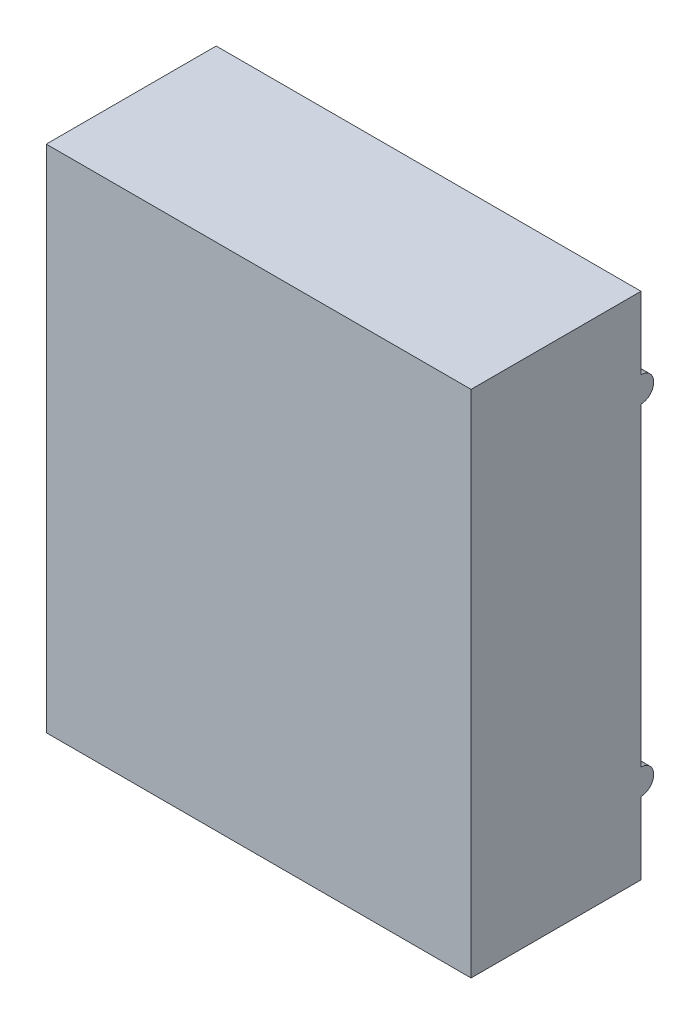
ISO-10303-21;
HEADER;
FILE_DESCRIPTION(('STEP AP214'),'2;1');
FILE_NAME('part.step','',(''),(''),'','','');
FILE_SCHEMA(('AUTOMOTIVE_DESIGN { 1 0 10303 214 1 1 1 1 }'));
ENDSEC;
DATA;
#1=APPLICATION_CONTEXT('core data for automotive mechanical design processes');
#2=APPLICATION_PROTOCOL_DEFINITION('international standard','automotive_design',2000,#1);
#3=PRODUCT_CONTEXT('',#1,'mechanical');
#4=PRODUCT('Part','Part','',(#3));
#5=PRODUCT_RELATED_PRODUCT_CATEGORY('part','',(#4));
#6=PRODUCT_DEFINITION_FORMATION('','',#4);
#7=PRODUCT_DEFINITION_CONTEXT('part definition',#1,'design');
#8=PRODUCT_DEFINITION('design','',#6,#7);
#9=PRODUCT_DEFINITION_SHAPE('','',#8);
#10=(LENGTH_UNIT() NAMED_UNIT(*) SI_UNIT(.MILLI.,.METRE.));
#11=(NAMED_UNIT(*) PLANE_ANGLE_UNIT() SI_UNIT($,.RADIAN.));
#12=(NAMED_UNIT(*) SI_UNIT($,.STERADIAN.) SOLID_ANGLE_UNIT());
#13=UNCERTAINTY_MEASURE_WITH_UNIT(LENGTH_MEASURE(1.E-05),#10,'distance_accuracy_value','');
#14=(GEOMETRIC_REPRESENTATION_CONTEXT(3) GLOBAL_UNCERTAINTY_ASSIGNED_CONTEXT((#13)) GLOBAL_UNIT_ASSIGNED_CONTEXT((#10,
#11,#12)) REPRESENTATION_CONTEXT('',''));
#15=CARTESIAN_POINT('',(0.,0.,0.));
#16=DIRECTION('',(0.,0.,1.));
#17=DIRECTION('',(1.,0.,0.));
#18=AXIS2_PLACEMENT_3D('',#15,#16,#17);
#19=CARTESIAN_POINT('',(0.,0.,0.));
#20=DIRECTION('',(0.,0.,-1.));
#21=DIRECTION('',(-1.,0.,0.));
#22=AXIS2_PLACEMENT_3D('',#19,#20,#21);
#23=PLANE('',#22);
#24=DIRECTION('',(1.,0.,0.));
#25=VECTOR('',#24,1.);
#26=CARTESIAN_POINT('',(115.,-92.5,0.));
#27=LINE('',#26,#25);
#28=CARTESIAN_POINT('',(115.,-92.5,0.));
#29=VERTEX_POINT('',#28);
#30=CARTESIAN_POINT('',(125.,-92.5,0.));
#31=VERTEX_POINT('',#30);
#32=EDGE_CURVE('E173',#29,#31,#27,.T.);
#33=ORIENTED_EDGE('',*,*,#32,.F.);
#34=DIRECTION('',(0.,-1.,0.));
#35=VECTOR('',#34,1.);
#36=CARTESIAN_POINT('',(115.,0.,0.));
#37=LINE('',#36,#35);
#38=CARTESIAN_POINT('',(115.,-107.5,0.));
#39=VERTEX_POINT('',#38);
#40=EDGE_CURVE('E11',#29,#39,#37,.T.);
#41=ORIENTED_EDGE('',*,*,#40,.T.);
#42=DIRECTION('',(1.,0.,0.));
#43=VECTOR('',#42,1.);
#44=CARTESIAN_POINT('',(115.,-107.5,0.));
#45=LINE('',#44,#43);
#46=CARTESIAN_POINT('',(125.,-107.5,0.));
#47=VERTEX_POINT('',#46);
#48=EDGE_CURVE('E175',#47,#39,#45,.F.);
#49=ORIENTED_EDGE('',*,*,#48,.F.);
#50=DIRECTION('',(0.,1.,0.));
#51=VECTOR('',#50,1.);
#52=CARTESIAN_POINT('',(125.,-150.,0.));
#53=LINE('',#52,#51);
#54=CARTESIAN_POINT('',(125.,-150.,0.));
#55=VERTEX_POINT('',#54);
#56=EDGE_CURVE('E276',#55,#47,#53,.T.);
#57=ORIENTED_EDGE('',*,*,#56,.F.);
#58=DIRECTION('',(1.,0.,0.));
#59=VECTOR('',#58,1.);
#60=CARTESIAN_POINT('',(-125.,-150.,0.));
#61=LINE('',#60,#59);
#62=CARTESIAN_POINT('',(-125.,-150.,0.));
#63=VERTEX_POINT('',#62);
#64=EDGE_CURVE('E266',#63,#55,#61,.T.);
#65=ORIENTED_EDGE('',*,*,#64,.F.);
#66=DIRECTION('',(0.,-1.,0.));
#67=VECTOR('',#66,1.);
#68=CARTESIAN_POINT('',(-125.,-150.,0.));
#69=LINE('',#68,#67);
#70=CARTESIAN_POINT('',(-125.,-107.5,0.));
#71=VERTEX_POINT('',#70);
#72=EDGE_CURVE('E282',#71,#63,#69,.T.);
#73=ORIENTED_EDGE('',*,*,#72,.F.);
#74=DIRECTION('',(-1.,0.,0.));
#75=VECTOR('',#74,1.);
#76=CARTESIAN_POINT('',(-115.,-107.5,0.));
#77=LINE('',#76,#75);
#78=CARTESIAN_POINT('',(-115.,-107.5,0.));
#79=VERTEX_POINT('',#78);
#80=EDGE_CURVE('E209',#79,#71,#77,.T.);
#81=ORIENTED_EDGE('',*,*,#80,.F.);
#82=DIRECTION('',(0.,1.,0.));
#83=VECTOR('',#82,1.);
#84=CARTESIAN_POINT('',(-115.,0.,0.));
#85=LINE('',#84,#83);
#86=CARTESIAN_POINT('',(-115.,-92.5,0.));
#87=VERTEX_POINT('',#86);
#88=EDGE_CURVE('E339',#79,#87,#85,.T.);
#89=ORIENTED_EDGE('',*,*,#88,.T.);
#90=DIRECTION('',(-1.,0.,0.));
#91=VECTOR('',#90,1.);
#92=CARTESIAN_POINT('',(-115.,-92.5,0.));
#93=LINE('',#92,#91);
#94=CARTESIAN_POINT('',(-125.,-92.5,0.));
#95=VERTEX_POINT('',#94);
#96=EDGE_CURVE('E204',#95,#87,#93,.F.);
#97=ORIENTED_EDGE('',*,*,#96,.F.);
#98=CARTESIAN_POINT('',(-125.,92.5,0.));
#99=VERTEX_POINT('',#98);
#100=EDGE_CURVE('E287',#99,#95,#69,.T.);
#101=ORIENTED_EDGE('',*,*,#100,.F.);
#102=DIRECTION('',(-1.,0.,0.));
#103=VECTOR('',#102,1.);
#104=CARTESIAN_POINT('',(-115.,92.5,0.));
#105=LINE('',#104,#103);
#106=CARTESIAN_POINT('',(-115.,92.5,0.));
#107=VERTEX_POINT('',#106);
#108=EDGE_CURVE('E223',#107,#99,#105,.T.);
#109=ORIENTED_EDGE('',*,*,#108,.F.);
#110=DIRECTION('',(0.,1.,0.));
#111=VECTOR('',#110,1.);
#112=CARTESIAN_POINT('',(-115.,0.,0.));
#113=LINE('',#112,#111);
#114=CARTESIAN_POINT('',(-115.,107.5,0.));
#115=VERTEX_POINT('',#114);
#116=EDGE_CURVE('E329',#107,#115,#113,.T.);
#117=ORIENTED_EDGE('',*,*,#116,.T.);
#118=DIRECTION('',(-1.,0.,0.));
#119=VECTOR('',#118,1.);
#120=CARTESIAN_POINT('',(-115.,107.5,0.));
#121=LINE('',#120,#119);
#122=CARTESIAN_POINT('',(-125.,107.5,0.));
#123=VERTEX_POINT('',#122);
#124=EDGE_CURVE('E218',#123,#115,#121,.F.);
#125=ORIENTED_EDGE('',*,*,#124,.F.);
#126=CARTESIAN_POINT('',(-125.,150.,0.));
#127=VERTEX_POINT('',#126);
#128=EDGE_CURVE('E283',#127,#123,#69,.T.);
#129=ORIENTED_EDGE('',*,*,#128,.F.);
#130=DIRECTION('',(-1.,0.,0.));
#131=VECTOR('',#130,1.);
#132=CARTESIAN_POINT('',(-125.,150.,0.));
#133=LINE('',#132,#131);
#134=CARTESIAN_POINT('',(125.,150.,0.));
#135=VERTEX_POINT('',#134);
#136=EDGE_CURVE('E279',#135,#127,#133,.T.);
#137=ORIENTED_EDGE('',*,*,#136,.F.);
#138=CARTESIAN_POINT('',(125.,107.5,0.));
#139=VERTEX_POINT('',#138);
#140=EDGE_CURVE('E260',#139,#135,#53,.T.);
#141=ORIENTED_EDGE('',*,*,#140,.F.);
#142=DIRECTION('',(1.,0.,0.));
#143=VECTOR('',#142,1.);
#144=CARTESIAN_POINT('',(115.,107.5,0.));
#145=LINE('',#144,#143);
#146=CARTESIAN_POINT('',(115.,107.5,0.));
#147=VERTEX_POINT('',#146);
#148=EDGE_CURVE('E196',#147,#139,#145,.T.);
#149=ORIENTED_EDGE('',*,*,#148,.F.);
#150=DIRECTION('',(0.,-1.,0.));
#151=VECTOR('',#150,1.);
#152=CARTESIAN_POINT('',(115.,0.,0.));
#153=LINE('',#152,#151);
#154=CARTESIAN_POINT('',(115.,92.5,0.));
#155=VERTEX_POINT('',#154);
#156=EDGE_CURVE('E50',#147,#155,#153,.T.);
#157=ORIENTED_EDGE('',*,*,#156,.T.);
#158=DIRECTION('',(1.,0.,0.));
#159=VECTOR('',#158,1.);
#160=CARTESIAN_POINT('',(115.,92.5,0.));
#161=LINE('',#160,#159);
#162=CARTESIAN_POINT('',(125.,92.5,0.));
#163=VERTEX_POINT('',#162);
#164=EDGE_CURVE('E192',#163,#155,#161,.F.);
#165=ORIENTED_EDGE('',*,*,#164,.F.);
#166=EDGE_CURVE('E180',#31,#163,#53,.T.);
#167=ORIENTED_EDGE('',*,*,#166,.F.);
#168=EDGE_LOOP('',(#33,#41,#49,#57,#65,#73,#81,#89,#97,#101,#109,#117,#125,#129,#137,#141,#149,
#157,#165,#167));
#169=FACE_BOUND('',#168,.T.);
#170=DIRECTION('',(0.,1.,0.));
#171=VECTOR('',#170,1.);
#172=CARTESIAN_POINT('',(7.50000000000002,0.,0.));
#173=LINE('',#172,#171);
#174=CARTESIAN_POINT('',(7.50000000000002,92.5,0.));
#175=VERTEX_POINT('',#174);
#176=CARTESIAN_POINT('',(7.50000000000002,107.5,0.));
#177=VERTEX_POINT('',#176);
#178=EDGE_CURVE('E228',#175,#177,#173,.T.);
#179=ORIENTED_EDGE('',*,*,#178,.T.);
#180=DIRECTION('',(1.,0.,0.));
#181=VECTOR('',#180,1.);
#182=CARTESIAN_POINT('',(0.,107.5,0.));
#183=LINE('',#182,#181);
#184=CARTESIAN_POINT('',(-7.49999999999998,107.5,0.));
#185=VERTEX_POINT('',#184);
#186=EDGE_CURVE('E241',#185,#177,#183,.T.);
#187=ORIENTED_EDGE('',*,*,#186,.F.);
#188=DIRECTION('',(0.,1.,0.));
#189=VECTOR('',#188,1.);
#190=CARTESIAN_POINT('',(-7.49999999999998,0.,0.));
#191=LINE('',#190,#189);
#192=CARTESIAN_POINT('',(-7.49999999999998,92.5,0.));
#193=VERTEX_POINT('',#192);
#194=EDGE_CURVE('E237',#193,#185,#191,.T.);
#195=ORIENTED_EDGE('',*,*,#194,.F.);
#196=DIRECTION('',(1.,0.,0.));
#197=VECTOR('',#196,1.);
#198=CARTESIAN_POINT('',(0.,92.5,0.));
#199=LINE('',#198,#197);
#200=EDGE_CURVE('E232',#193,#175,#199,.T.);
#201=ORIENTED_EDGE('',*,*,#200,.T.);
#202=EDGE_LOOP('',(#179,#187,#195,#201));
#203=FACE_BOUND('',#202,.T.);
#204=DIRECTION('',(0.,1.,0.));
#205=VECTOR('',#204,1.);
#206=CARTESIAN_POINT('',(7.49999999999999,0.,0.));
#207=LINE('',#206,#205);
#208=CARTESIAN_POINT('',(7.49999999999999,-107.5,0.));
#209=VERTEX_POINT('',#208);
#210=CARTESIAN_POINT('',(7.49999999999999,-92.5,0.));
#211=VERTEX_POINT('',#210);
#212=EDGE_CURVE('E249',#209,#211,#207,.T.);
#213=ORIENTED_EDGE('',*,*,#212,.T.);
#214=DIRECTION('',(1.,0.,0.));
#215=VECTOR('',#214,1.);
#216=CARTESIAN_POINT('',(0.,-92.5,0.));
#217=LINE('',#216,#215);
#218=CARTESIAN_POINT('',(-7.50000000000001,-92.5,0.));
#219=VERTEX_POINT('',#218);
#220=EDGE_CURVE('E245',#219,#211,#217,.T.);
#221=ORIENTED_EDGE('',*,*,#220,.F.);
#222=DIRECTION('',(0.,1.,0.));
#223=VECTOR('',#222,1.);
#224=CARTESIAN_POINT('',(-7.50000000000001,0.,0.));
#225=LINE('',#224,#223);
#226=CARTESIAN_POINT('',(-7.50000000000001,-107.5,0.));
#227=VERTEX_POINT('',#226);
#228=EDGE_CURVE('E257',#227,#219,#225,.T.);
#229=ORIENTED_EDGE('',*,*,#228,.F.);
#230=DIRECTION('',(1.,0.,0.));
#231=VECTOR('',#230,1.);
#232=CARTESIAN_POINT('',(0.,-107.5,0.));
#233=LINE('',#232,#231);
#234=EDGE_CURVE('E253',#227,#209,#233,.T.);
#235=ORIENTED_EDGE('',*,*,#234,.T.);
#236=EDGE_LOOP('',(#213,#221,#229,#235));
#237=FACE_BOUND('',#236,.T.);
#238=ADVANCED_FACE('F41',(#169,#203,#237),#23,.T.);
#239=CARTESIAN_POINT('',(125.,-150.,100.));
#240=DIRECTION('',(-1.,0.,0.));
#241=DIRECTION('',(0.,0.,1.));
#242=AXIS2_PLACEMENT_3D('',#239,#240,#241);
#243=PLANE('',#242);
#244=ORIENTED_EDGE('',*,*,#56,.T.);
#245=CARTESIAN_POINT('',(125.,-100.,0.));
#246=DIRECTION('',(1.,0.,0.));
#247=DIRECTION('',(0.,0.,-1.));
#248=AXIS2_PLACEMENT_3D('',#245,#246,#247);
#249=CIRCLE('',#248,7.49999999999999);
#250=EDGE_CURVE('E57',#47,#31,#249,.T.);
#251=ORIENTED_EDGE('',*,*,#250,.T.);
#252=ORIENTED_EDGE('',*,*,#166,.T.);
#253=CARTESIAN_POINT('',(125.,100.,0.));
#254=DIRECTION('',(1.,0.,0.));
#255=DIRECTION('',(0.,0.,-1.));
#256=AXIS2_PLACEMENT_3D('',#253,#254,#255);
#257=CIRCLE('',#256,7.50000000000001);
#258=EDGE_CURVE('E63',#163,#139,#257,.T.);
#259=ORIENTED_EDGE('',*,*,#258,.T.);
#260=ORIENTED_EDGE('',*,*,#140,.T.);
#261=DIRECTION('',(0.,0.,-1.));
#262=VECTOR('',#261,1.);
#263=CARTESIAN_POINT('',(125.,150.,100.));
#264=LINE('',#263,#262);
#265=CARTESIAN_POINT('',(125.,150.,100.));
#266=VERTEX_POINT('',#265);
#267=EDGE_CURVE('E301',#266,#135,#264,.T.);
#268=ORIENTED_EDGE('',*,*,#267,.F.);
#269=DIRECTION('',(0.,1.,0.));
#270=VECTOR('',#269,1.);
#271=CARTESIAN_POINT('',(125.,-150.,100.));
#272=LINE('',#271,#270);
#273=CARTESIAN_POINT('',(125.,-150.,100.));
#274=VERTEX_POINT('',#273);
#275=EDGE_CURVE('E261',#274,#266,#272,.T.);
#276=ORIENTED_EDGE('',*,*,#275,.F.);
#277=DIRECTION('',(0.,0.,-1.));
#278=VECTOR('',#277,1.);
#279=CARTESIAN_POINT('',(125.,-150.,100.));
#280=LINE('',#279,#278);
#281=EDGE_CURVE('E275',#274,#55,#280,.T.);
#282=ORIENTED_EDGE('',*,*,#281,.T.);
#283=EDGE_LOOP('',(#244,#251,#252,#259,#260,#268,#276,#282));
#284=FACE_BOUND('',#283,.T.);
#285=ADVANCED_FACE('F356',(#284),#243,.F.);
#286=CARTESIAN_POINT('',(-125.,150.,100.));
#287=DIRECTION('',(0.,-1.,0.));
#288=DIRECTION('',(0.,0.,-1.));
#289=AXIS2_PLACEMENT_3D('',#286,#287,#288);
#290=PLANE('',#289);
#291=ORIENTED_EDGE('',*,*,#136,.T.);
#292=DIRECTION('',(0.,0.,-1.));
#293=VECTOR('',#292,1.);
#294=CARTESIAN_POINT('',(-125.,150.,100.));
#295=LINE('',#294,#293);
#296=CARTESIAN_POINT('',(-125.,150.,100.));
#297=VERTEX_POINT('',#296);
#298=EDGE_CURVE('E297',#297,#127,#295,.T.);
#299=ORIENTED_EDGE('',*,*,#298,.F.);
#300=DIRECTION('',(-1.,0.,0.));
#301=VECTOR('',#300,1.);
#302=CARTESIAN_POINT('',(-125.,150.,100.));
#303=LINE('',#302,#301);
#304=EDGE_CURVE('E265',#266,#297,#303,.T.);
#305=ORIENTED_EDGE('',*,*,#304,.F.);
#306=ORIENTED_EDGE('',*,*,#267,.T.);
#307=EDGE_LOOP('',(#291,#299,#305,#306));
#308=FACE_BOUND('',#307,.T.);
#309=ADVANCED_FACE('F359',(#308),#290,.F.);
#310=CARTESIAN_POINT('',(-125.,-150.,100.));
#311=DIRECTION('',(1.,0.,0.));
#312=DIRECTION('',(0.,0.,-1.));
#313=AXIS2_PLACEMENT_3D('',#310,#311,#312);
#314=PLANE('',#313);
#315=ORIENTED_EDGE('',*,*,#100,.T.);
#316=CARTESIAN_POINT('',(-125.,-100.,0.));
#317=DIRECTION('',(-1.,0.,0.));
#318=DIRECTION('',(0.,0.,1.));
#319=AXIS2_PLACEMENT_3D('',#316,#317,#318);
#320=CIRCLE('',#319,7.5);
#321=EDGE_CURVE('E199',#95,#71,#320,.T.);
#322=ORIENTED_EDGE('',*,*,#321,.T.);
#323=ORIENTED_EDGE('',*,*,#72,.T.);
#324=DIRECTION('',(0.,0.,-1.));
#325=VECTOR('',#324,1.);
#326=CARTESIAN_POINT('',(-125.,-150.,100.));
#327=LINE('',#326,#325);
#328=CARTESIAN_POINT('',(-125.,-150.,100.));
#329=VERTEX_POINT('',#328);
#330=EDGE_CURVE('E293',#329,#63,#327,.T.);
#331=ORIENTED_EDGE('',*,*,#330,.F.);
#332=DIRECTION('',(0.,-1.,0.));
#333=VECTOR('',#332,1.);
#334=CARTESIAN_POINT('',(-125.,-150.,100.));
#335=LINE('',#334,#333);
#336=EDGE_CURVE('E269',#297,#329,#335,.T.);
#337=ORIENTED_EDGE('',*,*,#336,.F.);
#338=ORIENTED_EDGE('',*,*,#298,.T.);
#339=ORIENTED_EDGE('',*,*,#128,.T.);
#340=CARTESIAN_POINT('',(-125.,100.,0.));
#341=DIRECTION('',(-1.,0.,0.));
#342=DIRECTION('',(0.,0.,1.));
#343=AXIS2_PLACEMENT_3D('',#340,#341,#342);
#344=CIRCLE('',#343,7.5);
#345=EDGE_CURVE('E213',#123,#99,#344,.T.);
#346=ORIENTED_EDGE('',*,*,#345,.T.);
#347=EDGE_LOOP('',(#315,#322,#323,#331,#337,#338,#339,#346));
#348=FACE_BOUND('',#347,.T.);
#349=ADVANCED_FACE('F366',(#348),#314,.F.);
#350=CARTESIAN_POINT('',(-125.,-150.,100.));
#351=DIRECTION('',(0.,1.,0.));
#352=DIRECTION('',(0.,0.,1.));
#353=AXIS2_PLACEMENT_3D('',#350,#351,#352);
#354=PLANE('',#353);
#355=ORIENTED_EDGE('',*,*,#64,.T.);
#356=ORIENTED_EDGE('',*,*,#281,.F.);
#357=DIRECTION('',(1.,0.,0.));
#358=VECTOR('',#357,1.);
#359=CARTESIAN_POINT('',(-125.,-150.,100.));
#360=LINE('',#359,#358);
#361=EDGE_CURVE('E272',#329,#274,#360,.T.);
#362=ORIENTED_EDGE('',*,*,#361,.F.);
#363=ORIENTED_EDGE('',*,*,#330,.T.);
#364=EDGE_LOOP('',(#355,#356,#362,#363));
#365=FACE_BOUND('',#364,.T.);
#366=ADVANCED_FACE('F414',(#365),#354,.F.);
#367=CARTESIAN_POINT('',(0.,0.,100.));
#368=DIRECTION('',(0.,0.,-1.));
#369=DIRECTION('',(-1.,0.,0.));
#370=AXIS2_PLACEMENT_3D('',#367,#368,#369);
#371=PLANE('',#370);
#372=ORIENTED_EDGE('',*,*,#275,.T.);
#373=ORIENTED_EDGE('',*,*,#304,.T.);
#374=ORIENTED_EDGE('',*,*,#336,.T.);
#375=ORIENTED_EDGE('',*,*,#361,.T.);
#376=EDGE_LOOP('',(#372,#373,#374,#375));
#377=FACE_BOUND('',#376,.T.);
#378=ADVANCED_FACE('F406',(#377),#371,.F.);
#379=CARTESIAN_POINT('',(7.49999999999999,0.,-7.5));
#380=DIRECTION('',(1.,0.,0.));
#381=DIRECTION('',(0.,0.,-1.));
#382=AXIS2_PLACEMENT_3D('',#379,#380,#381);
#383=PLANE('',#382);
#384=ORIENTED_EDGE('',*,*,#212,.F.);
#385=CARTESIAN_POINT('',(7.49999999999999,-100.,0.));
#386=DIRECTION('',(1.,0.,0.));
#387=DIRECTION('',(0.,0.,-1.));
#388=AXIS2_PLACEMENT_3D('',#385,#386,#387);
#389=CIRCLE('',#388,7.5);
#390=CARTESIAN_POINT('',(7.49999999999999,-100.,-7.5));
#391=VERTEX_POINT('',#390);
#392=EDGE_CURVE('E320',#209,#391,#389,.T.);
#393=ORIENTED_EDGE('',*,*,#392,.T.);
#394=CARTESIAN_POINT('',(7.49999999999999,-100.,0.));
#395=DIRECTION('',(1.,0.,0.));
#396=DIRECTION('',(0.,0.,-1.));
#397=AXIS2_PLACEMENT_3D('',#394,#395,#396);
#398=CIRCLE('',#397,7.5);
#399=EDGE_CURVE('E317',#391,#211,#398,.T.);
#400=ORIENTED_EDGE('',*,*,#399,.T.);
#401=EDGE_LOOP('',(#384,#393,#400));
#402=FACE_BOUND('',#401,.T.);
#403=ADVANCED_FACE('F404',(#402),#383,.T.);
#404=CARTESIAN_POINT('',(-7.50000000000001,0.,-7.5));
#405=DIRECTION('',(1.,0.,0.));
#406=DIRECTION('',(0.,0.,-1.));
#407=AXIS2_PLACEMENT_3D('',#404,#405,#406);
#408=PLANE('',#407);
#409=CARTESIAN_POINT('',(-7.50000000000001,-100.,0.));
#410=DIRECTION('',(1.,0.,0.));
#411=DIRECTION('',(0.,0.,-1.));
#412=AXIS2_PLACEMENT_3D('',#409,#410,#411);
#413=CIRCLE('',#412,7.5);
#414=CARTESIAN_POINT('',(-7.50000000000001,-100.,-7.5));
#415=VERTEX_POINT('',#414);
#416=EDGE_CURVE('E323',#219,#415,#413,.F.);
#417=ORIENTED_EDGE('',*,*,#416,.T.);
#418=CARTESIAN_POINT('',(-7.50000000000001,-100.,0.));
#419=DIRECTION('',(1.,0.,0.));
#420=DIRECTION('',(0.,0.,-1.));
#421=AXIS2_PLACEMENT_3D('',#418,#419,#420);
#422=CIRCLE('',#421,7.5);
#423=EDGE_CURVE('E326',#415,#227,#422,.F.);
#424=ORIENTED_EDGE('',*,*,#423,.T.);
#425=ORIENTED_EDGE('',*,*,#228,.T.);
#426=EDGE_LOOP('',(#417,#424,#425));
#427=FACE_BOUND('',#426,.T.);
#428=ADVANCED_FACE('F397',(#427),#408,.F.);
#429=CARTESIAN_POINT('',(7.50000000000002,0.,-7.5));
#430=DIRECTION('',(1.,0.,0.));
#431=DIRECTION('',(0.,0.,-1.));
#432=AXIS2_PLACEMENT_3D('',#429,#430,#431);
#433=PLANE('',#432);
#434=CARTESIAN_POINT('',(7.50000000000002,100.,0.));
#435=DIRECTION('',(1.,0.,0.));
#436=DIRECTION('',(0.,0.,-1.));
#437=AXIS2_PLACEMENT_3D('',#434,#435,#436);
#438=CIRCLE('',#437,7.5);
#439=CARTESIAN_POINT('',(7.50000000000002,100.,-7.5));
#440=VERTEX_POINT('',#439);
#441=EDGE_CURVE('E305',#175,#440,#438,.T.);
#442=ORIENTED_EDGE('',*,*,#441,.T.);
#443=CARTESIAN_POINT('',(7.50000000000002,100.,0.));
#444=DIRECTION('',(1.,0.,0.));
#445=DIRECTION('',(0.,0.,-1.));
#446=AXIS2_PLACEMENT_3D('',#443,#444,#445);
#447=CIRCLE('',#446,7.5);
#448=EDGE_CURVE('E308',#440,#177,#447,.T.);
#449=ORIENTED_EDGE('',*,*,#448,.T.);
#450=ORIENTED_EDGE('',*,*,#178,.F.);
#451=EDGE_LOOP('',(#442,#449,#450));
#452=FACE_BOUND('',#451,.T.);
#453=ADVANCED_FACE('F412',(#452),#433,.T.);
#454=CARTESIAN_POINT('',(-7.49999999999998,0.,-7.5));
#455=DIRECTION('',(1.,0.,0.));
#456=DIRECTION('',(0.,1.,0.));
#457=AXIS2_PLACEMENT_3D('',#454,#455,#456);
#458=PLANE('',#457);
#459=ORIENTED_EDGE('',*,*,#194,.T.);
#460=CARTESIAN_POINT('',(-7.49999999999998,100.,0.));
#461=DIRECTION('',(1.,0.,0.));
#462=DIRECTION('',(0.,1.,0.));
#463=AXIS2_PLACEMENT_3D('',#460,#461,#462);
#464=CIRCLE('',#463,7.5);
#465=CARTESIAN_POINT('',(-7.49999999999998,100.,-7.5));
#466=VERTEX_POINT('',#465);
#467=EDGE_CURVE('E314',#185,#466,#464,.F.);
#468=ORIENTED_EDGE('',*,*,#467,.T.);
#469=CARTESIAN_POINT('',(-7.49999999999998,100.,0.));
#470=DIRECTION('',(1.,0.,0.));
#471=DIRECTION('',(0.,1.,0.));
#472=AXIS2_PLACEMENT_3D('',#469,#470,#471);
#473=CIRCLE('',#472,7.5);
#474=EDGE_CURVE('E311',#466,#193,#473,.F.);
#475=ORIENTED_EDGE('',*,*,#474,.T.);
#476=EDGE_LOOP('',(#459,#468,#475));
#477=FACE_BOUND('',#476,.T.);
#478=ADVANCED_FACE('F379',(#477),#458,.F.);
#479=CARTESIAN_POINT('',(0.,100.,0.));
#480=DIRECTION('',(1.,0.,0.));
#481=DIRECTION('',(0.,0.,-1.));
#482=AXIS2_PLACEMENT_3D('',#479,#480,#481);
#483=CYLINDRICAL_SURFACE('',#482,7.5);
#484=ORIENTED_EDGE('',*,*,#200,.F.);
#485=ORIENTED_EDGE('',*,*,#474,.F.);
#486=DIRECTION('',(1.,0.,0.));
#487=VECTOR('',#486,1.);
#488=CARTESIAN_POINT('',(0.,100.,-7.5));
#489=LINE('',#488,#487);
#490=EDGE_CURVE('E233',#440,#466,#489,.F.);
#491=ORIENTED_EDGE('',*,*,#490,.F.);
#492=ORIENTED_EDGE('',*,*,#441,.F.);
#493=EDGE_LOOP('',(#484,#485,#491,#492));
#494=FACE_BOUND('',#493,.T.);
#495=ADVANCED_FACE('F376',(#494),#483,.T.);
#496=CARTESIAN_POINT('',(0.,100.,0.));
#497=DIRECTION('',(-1.,0.,0.));
#498=DIRECTION('',(0.,0.,1.));
#499=AXIS2_PLACEMENT_3D('',#496,#497,#498);
#500=CYLINDRICAL_SURFACE('',#499,7.5);
#501=ORIENTED_EDGE('',*,*,#467,.F.);
#502=ORIENTED_EDGE('',*,*,#186,.T.);
#503=ORIENTED_EDGE('',*,*,#448,.F.);
#504=ORIENTED_EDGE('',*,*,#490,.T.);
#505=EDGE_LOOP('',(#501,#502,#503,#504));
#506=FACE_BOUND('',#505,.T.);
#507=ADVANCED_FACE('F373',(#506),#500,.T.);
#508=CARTESIAN_POINT('',(0.,-100.,0.));
#509=DIRECTION('',(-1.,0.,0.));
#510=DIRECTION('',(0.,0.,1.));
#511=AXIS2_PLACEMENT_3D('',#508,#509,#510);
#512=CYLINDRICAL_SURFACE('',#511,7.5);
#513=DIRECTION('',(1.,0.,0.));
#514=VECTOR('',#513,1.);
#515=CARTESIAN_POINT('',(7.49999999999999,-100.,-7.5));
#516=LINE('',#515,#514);
#517=EDGE_CURVE('E227',#415,#391,#516,.T.);
#518=ORIENTED_EDGE('',*,*,#517,.F.);
#519=ORIENTED_EDGE('',*,*,#416,.F.);
#520=ORIENTED_EDGE('',*,*,#220,.T.);
#521=ORIENTED_EDGE('',*,*,#399,.F.);
#522=EDGE_LOOP('',(#518,#519,#520,#521));
#523=FACE_BOUND('',#522,.T.);
#524=ADVANCED_FACE('F43',(#523),#512,.T.);
#525=CARTESIAN_POINT('',(0.,-100.,0.));
#526=DIRECTION('',(1.,0.,0.));
#527=DIRECTION('',(0.,0.,-1.));
#528=AXIS2_PLACEMENT_3D('',#525,#526,#527);
#529=CYLINDRICAL_SURFACE('',#528,7.5);
#530=ORIENTED_EDGE('',*,*,#423,.F.);
#531=ORIENTED_EDGE('',*,*,#517,.T.);
#532=ORIENTED_EDGE('',*,*,#392,.F.);
#533=ORIENTED_EDGE('',*,*,#234,.F.);
#534=EDGE_LOOP('',(#530,#531,#532,#533));
#535=FACE_BOUND('',#534,.T.);
#536=ADVANCED_FACE('F381',(#535),#529,.T.);
#537=CARTESIAN_POINT('',(-115.,100.,0.));
#538=DIRECTION('',(-1.,0.,0.));
#539=DIRECTION('',(0.,0.,1.));
#540=AXIS2_PLACEMENT_3D('',#537,#538,#539);
#541=CYLINDRICAL_SURFACE('',#540,7.5);
#542=CARTESIAN_POINT('',(-115.,100.,0.));
#543=DIRECTION('',(-1.,0.,0.));
#544=DIRECTION('',(0.,0.,1.));
#545=AXIS2_PLACEMENT_3D('',#542,#543,#544);
#546=CIRCLE('',#545,7.5);
#547=EDGE_CURVE('E214',#115,#107,#546,.T.);
#548=ORIENTED_EDGE('',*,*,#547,.T.);
#549=ORIENTED_EDGE('',*,*,#108,.T.);
#550=ORIENTED_EDGE('',*,*,#345,.F.);
#551=ORIENTED_EDGE('',*,*,#124,.T.);
#552=EDGE_LOOP('',(#548,#549,#550,#551));
#553=FACE_BOUND('',#552,.T.);
#554=ADVANCED_FACE('F382',(#553),#541,.T.);
#555=CARTESIAN_POINT('',(-115.,100.,0.));
#556=DIRECTION('',(-1.,0.,0.));
#557=DIRECTION('',(0.,0.,1.));
#558=AXIS2_PLACEMENT_3D('',#555,#556,#557);
#559=PLANE('',#558);
#560=ORIENTED_EDGE('',*,*,#116,.F.);
#561=ORIENTED_EDGE('',*,*,#547,.F.);
#562=EDGE_LOOP('',(#560,#561));
#563=FACE_BOUND('',#562,.T.);
#564=ADVANCED_FACE('F388',(#563),#559,.F.);
#565=CARTESIAN_POINT('',(-115.,-100.,0.));
#566=DIRECTION('',(-1.,0.,0.));
#567=DIRECTION('',(0.,0.,1.));
#568=AXIS2_PLACEMENT_3D('',#565,#566,#567);
#569=CYLINDRICAL_SURFACE('',#568,7.5);
#570=CARTESIAN_POINT('',(-115.,-100.,0.));
#571=DIRECTION('',(-1.,0.,0.));
#572=DIRECTION('',(0.,0.,1.));
#573=AXIS2_PLACEMENT_3D('',#570,#571,#572);
#574=CIRCLE('',#573,7.5);
#575=EDGE_CURVE('E200',#87,#79,#574,.T.);
#576=ORIENTED_EDGE('',*,*,#575,.T.);
#577=ORIENTED_EDGE('',*,*,#80,.T.);
#578=ORIENTED_EDGE('',*,*,#321,.F.);
#579=ORIENTED_EDGE('',*,*,#96,.T.);
#580=EDGE_LOOP('',(#576,#577,#578,#579));
#581=FACE_BOUND('',#580,.T.);
#582=ADVANCED_FACE('F443',(#581),#569,.T.);
#583=CARTESIAN_POINT('',(-115.,-100.,0.));
#584=DIRECTION('',(-1.,0.,0.));
#585=DIRECTION('',(0.,0.,1.));
#586=AXIS2_PLACEMENT_3D('',#583,#584,#585);
#587=PLANE('',#586);
#588=ORIENTED_EDGE('',*,*,#88,.F.);
#589=ORIENTED_EDGE('',*,*,#575,.F.);
#590=EDGE_LOOP('',(#588,#589));
#591=FACE_BOUND('',#590,.T.);
#592=ADVANCED_FACE('F448',(#591),#587,.F.);
#593=CARTESIAN_POINT('',(115.,100.,0.));
#594=DIRECTION('',(1.,0.,0.));
#595=DIRECTION('',(0.,0.,-1.));
#596=AXIS2_PLACEMENT_3D('',#593,#594,#595);
#597=CYLINDRICAL_SURFACE('',#596,7.50000000000001);
#598=CARTESIAN_POINT('',(115.,100.,0.));
#599=DIRECTION('',(1.,0.,0.));
#600=DIRECTION('',(0.,0.,-1.));
#601=AXIS2_PLACEMENT_3D('',#598,#599,#600);
#602=CIRCLE('',#601,7.50000000000001);
#603=EDGE_CURVE('E185',#155,#147,#602,.T.);
#604=ORIENTED_EDGE('',*,*,#603,.T.);
#605=ORIENTED_EDGE('',*,*,#148,.T.);
#606=ORIENTED_EDGE('',*,*,#258,.F.);
#607=ORIENTED_EDGE('',*,*,#164,.T.);
#608=EDGE_LOOP('',(#604,#605,#606,#607));
#609=FACE_BOUND('',#608,.T.);
#610=ADVANCED_FACE('F350',(#609),#597,.T.);
#611=CARTESIAN_POINT('',(115.,100.,0.));
#612=DIRECTION('',(1.,0.,0.));
#613=DIRECTION('',(0.,0.,-1.));
#614=AXIS2_PLACEMENT_3D('',#611,#612,#613);
#615=PLANE('',#614);
#616=ORIENTED_EDGE('',*,*,#156,.F.);
#617=ORIENTED_EDGE('',*,*,#603,.F.);
#618=EDGE_LOOP('',(#616,#617));
#619=FACE_BOUND('',#618,.T.);
#620=ADVANCED_FACE('F348',(#619),#615,.F.);
#621=CARTESIAN_POINT('',(115.,-100.,0.));
#622=DIRECTION('',(1.,0.,0.));
#623=DIRECTION('',(0.,0.,-1.));
#624=AXIS2_PLACEMENT_3D('',#621,#622,#623);
#625=CYLINDRICAL_SURFACE('',#624,7.49999999999999);
#626=CARTESIAN_POINT('',(115.,-100.,0.));
#627=DIRECTION('',(1.,0.,0.));
#628=DIRECTION('',(0.,0.,-1.));
#629=AXIS2_PLACEMENT_3D('',#626,#627,#628);
#630=CIRCLE('',#629,7.49999999999999);
#631=EDGE_CURVE('E167',#39,#29,#630,.T.);
#632=ORIENTED_EDGE('',*,*,#631,.T.);
#633=ORIENTED_EDGE('',*,*,#32,.T.);
#634=ORIENTED_EDGE('',*,*,#250,.F.);
#635=ORIENTED_EDGE('',*,*,#48,.T.);
#636=EDGE_LOOP('',(#632,#633,#634,#635));
#637=FACE_BOUND('',#636,.T.);
#638=ADVANCED_FACE('F172',(#637),#625,.T.);
#639=CARTESIAN_POINT('',(115.,-100.,0.));
#640=DIRECTION('',(1.,0.,0.));
#641=DIRECTION('',(0.,0.,-1.));
#642=AXIS2_PLACEMENT_3D('',#639,#640,#641);
#643=PLANE('',#642);
#644=ORIENTED_EDGE('',*,*,#40,.F.);
#645=ORIENTED_EDGE('',*,*,#631,.F.);
#646=EDGE_LOOP('',(#644,#645));
#647=FACE_BOUND('',#646,.T.);
#648=ADVANCED_FACE('F166',(#647),#643,.F.);
#649=CLOSED_SHELL('',(#238,#285,#309,#349,#366,#378,#403,#428,#453,#478,#495,#507,#524,#536,
#554,#564,#582,#592,#610,#620,#638,#648));
#650=MANIFOLD_SOLID_BREP('B2',#649);
#651=ADVANCED_BREP_SHAPE_REPRESENTATION('',(#18,#650),#14);
#652=SHAPE_DEFINITION_REPRESENTATION(#9,#651);
ENDSEC;
END-ISO-10303-21;
